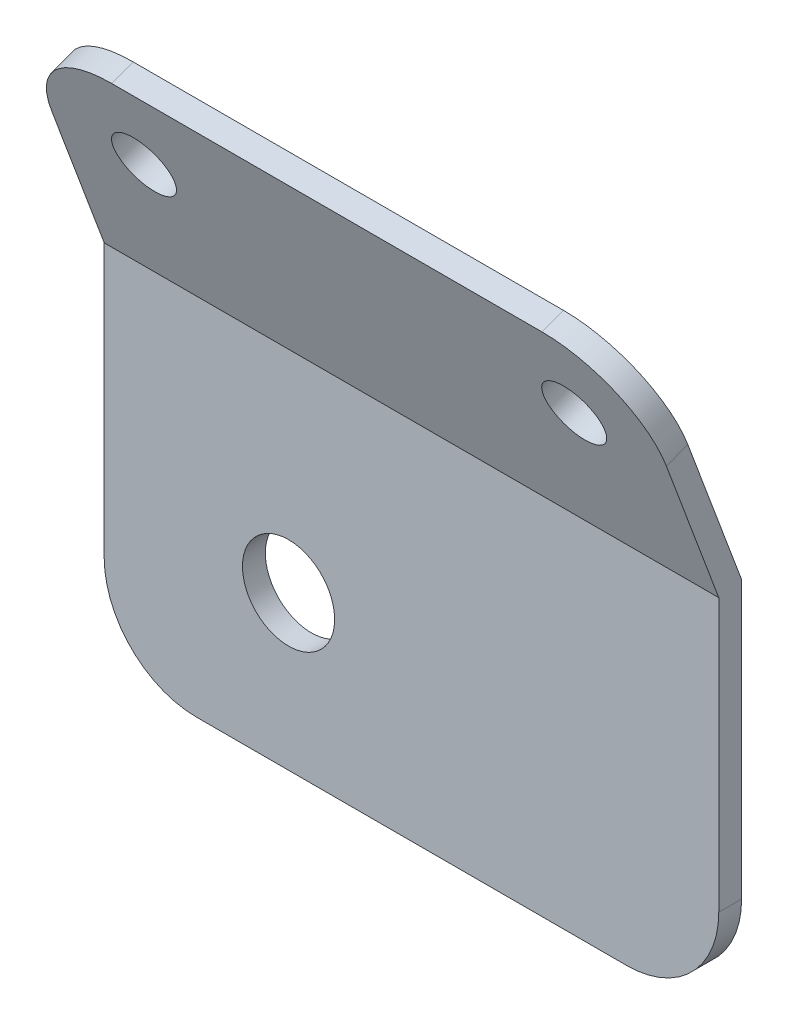
ISO-10303-21;
HEADER;
FILE_DESCRIPTION(('STEP AP214'),'2;1');
FILE_NAME('part.step','',(''),(''),'','','');
FILE_SCHEMA(('AUTOMOTIVE_DESIGN { 1 0 10303 214 1 1 1 1 }'));
ENDSEC;
DATA;
#1=APPLICATION_CONTEXT('core data for automotive mechanical design processes');
#2=APPLICATION_PROTOCOL_DEFINITION('international standard','automotive_design',2000,#1);
#3=PRODUCT_CONTEXT('',#1,'mechanical');
#4=PRODUCT('Part','Part','',(#3));
#5=PRODUCT_RELATED_PRODUCT_CATEGORY('part','',(#4));
#6=PRODUCT_DEFINITION_FORMATION('','',#4);
#7=PRODUCT_DEFINITION_CONTEXT('part definition',#1,'design');
#8=PRODUCT_DEFINITION('design','',#6,#7);
#9=PRODUCT_DEFINITION_SHAPE('','',#8);
#10=(LENGTH_UNIT() NAMED_UNIT(*) SI_UNIT(.MILLI.,.METRE.));
#11=(NAMED_UNIT(*) PLANE_ANGLE_UNIT() SI_UNIT($,.RADIAN.));
#12=(NAMED_UNIT(*) SI_UNIT($,.STERADIAN.) SOLID_ANGLE_UNIT());
#13=UNCERTAINTY_MEASURE_WITH_UNIT(LENGTH_MEASURE(1.E-05),#10,'distance_accuracy_value','');
#14=(GEOMETRIC_REPRESENTATION_CONTEXT(3) GLOBAL_UNCERTAINTY_ASSIGNED_CONTEXT((#13)) GLOBAL_UNIT_ASSIGNED_CONTEXT((#10,
#11,#12)) REPRESENTATION_CONTEXT('',''));
#15=CARTESIAN_POINT('',(0.,0.,0.));
#16=DIRECTION('',(0.,0.,1.));
#17=DIRECTION('',(1.,0.,0.));
#18=AXIS2_PLACEMENT_3D('',#15,#16,#17);
#19=CARTESIAN_POINT('',(31.75,0.,2.3622));
#20=DIRECTION('',(0.,0.,-1.));
#21=DIRECTION('',(0.,1.,0.));
#22=AXIS2_PLACEMENT_3D('',#19,#20,#21);
#23=PLANE('',#22);
#24=CARTESIAN_POINT('',(-12.7,-22.225,2.3622));
#25=DIRECTION('',(0.,0.,-1.));
#26=DIRECTION('',(0.,1.,0.));
#27=AXIS2_PLACEMENT_3D('',#24,#25,#26);
#28=CIRCLE('',#27,4.7625);
#29=CARTESIAN_POINT('',(-12.7,-17.4625,2.3622));
#30=VERTEX_POINT('',#29);
#31=EDGE_CURVE('E141',#30,#30,#28,.T.);
#32=ORIENTED_EDGE('',*,*,#31,.T.);
#33=EDGE_LOOP('',(#32));
#34=FACE_BOUND('',#33,.T.);
#35=DIRECTION('',(0.,-1.,0.));
#36=VECTOR('',#35,1.);
#37=CARTESIAN_POINT('',(-31.75,0.,2.3622));
#38=LINE('',#37,#36);
#39=CARTESIAN_POINT('',(-31.75,-0.427155344411784,2.3622));
#40=VERTEX_POINT('',#39);
#41=CARTESIAN_POINT('',(-31.75,-28.575,2.3622));
#42=VERTEX_POINT('',#41);
#43=EDGE_CURVE('E138',#40,#42,#38,.T.);
#44=ORIENTED_EDGE('',*,*,#43,.T.);
#45=CARTESIAN_POINT('',(-22.225,-28.575,2.3622));
#46=DIRECTION('',(0.,0.,-1.));
#47=DIRECTION('',(0.,1.,0.));
#48=AXIS2_PLACEMENT_3D('',#45,#46,#47);
#49=CIRCLE('',#48,9.525);
#50=CARTESIAN_POINT('',(-22.225,-38.1,2.3622));
#51=VERTEX_POINT('',#50);
#52=EDGE_CURVE('E179',#42,#51,#49,.F.);
#53=ORIENTED_EDGE('',*,*,#52,.T.);
#54=DIRECTION('',(-1.,0.,0.));
#55=VECTOR('',#54,1.);
#56=CARTESIAN_POINT('',(31.75,-38.1,2.3622));
#57=LINE('',#56,#55);
#58=CARTESIAN_POINT('',(22.225,-38.1,2.3622));
#59=VERTEX_POINT('',#58);
#60=EDGE_CURVE('E162',#59,#51,#57,.T.);
#61=ORIENTED_EDGE('',*,*,#60,.F.);
#62=CARTESIAN_POINT('',(22.225,-28.575,2.3622));
#63=DIRECTION('',(0.,0.,-1.));
#64=DIRECTION('',(0.,1.,0.));
#65=AXIS2_PLACEMENT_3D('',#62,#63,#64);
#66=CIRCLE('',#65,9.525);
#67=CARTESIAN_POINT('',(31.75,-28.575,2.3622));
#68=VERTEX_POINT('',#67);
#69=EDGE_CURVE('E177',#59,#68,#66,.F.);
#70=ORIENTED_EDGE('',*,*,#69,.T.);
#71=DIRECTION('',(0.,-1.,0.));
#72=VECTOR('',#71,1.);
#73=CARTESIAN_POINT('',(31.75,0.,2.3622));
#74=LINE('',#73,#72);
#75=CARTESIAN_POINT('',(31.75,-0.427155344411784,2.3622));
#76=VERTEX_POINT('',#75);
#77=EDGE_CURVE('E146',#76,#68,#74,.T.);
#78=ORIENTED_EDGE('',*,*,#77,.F.);
#79=DIRECTION('',(-1.,0.,0.));
#80=VECTOR('',#79,1.);
#81=CARTESIAN_POINT('',(31.75,-0.427155344411784,2.3622));
#82=LINE('',#81,#80);
#83=EDGE_CURVE('E154',#76,#40,#82,.T.);
#84=ORIENTED_EDGE('',*,*,#83,.T.);
#85=EDGE_LOOP('',(#44,#53,#61,#70,#78,#84));
#86=FACE_BOUND('',#85,.T.);
#87=ADVANCED_FACE('F34',(#34,#86),#23,.F.);
#88=CARTESIAN_POINT('',(31.75,-38.1,0.));
#89=DIRECTION('',(0.,-1.,0.));
#90=DIRECTION('',(0.,0.,-1.));
#91=AXIS2_PLACEMENT_3D('',#88,#89,#90);
#92=PLANE('',#91);
#93=ORIENTED_EDGE('',*,*,#60,.T.);
#94=DIRECTION('',(0.,0.,1.));
#95=VECTOR('',#94,1.);
#96=CARTESIAN_POINT('',(-22.225,-38.1,0.));
#97=LINE('',#96,#95);
#98=CARTESIAN_POINT('',(-22.225,-38.1,0.));
#99=VERTEX_POINT('',#98);
#100=EDGE_CURVE('E184',#51,#99,#97,.F.);
#101=ORIENTED_EDGE('',*,*,#100,.T.);
#102=DIRECTION('',(-1.,0.,0.));
#103=VECTOR('',#102,1.);
#104=CARTESIAN_POINT('',(31.75,-38.1,0.));
#105=LINE('',#104,#103);
#106=CARTESIAN_POINT('',(22.225,-38.1,0.));
#107=VERTEX_POINT('',#106);
#108=EDGE_CURVE('E131',#107,#99,#105,.T.);
#109=ORIENTED_EDGE('',*,*,#108,.F.);
#110=DIRECTION('',(0.,0.,1.));
#111=VECTOR('',#110,1.);
#112=CARTESIAN_POINT('',(22.225,-38.1,2.3622));
#113=LINE('',#112,#111);
#114=EDGE_CURVE('E181',#107,#59,#113,.T.);
#115=ORIENTED_EDGE('',*,*,#114,.T.);
#116=EDGE_LOOP('',(#93,#101,#109,#115));
#117=FACE_BOUND('',#116,.T.);
#118=ADVANCED_FACE('F223',(#117),#92,.T.);
#119=CARTESIAN_POINT('',(31.75,0.,0.));
#120=DIRECTION('',(0.,0.,-1.));
#121=DIRECTION('',(0.,1.,0.));
#122=AXIS2_PLACEMENT_3D('',#119,#120,#121);
#123=PLANE('',#122);
#124=CARTESIAN_POINT('',(-12.7,-22.225,0.));
#125=DIRECTION('',(0.,0.,-1.));
#126=DIRECTION('',(0.,1.,0.));
#127=AXIS2_PLACEMENT_3D('',#124,#125,#126);
#128=CIRCLE('',#127,4.7625);
#129=CARTESIAN_POINT('',(-12.7,-17.4625,0.));
#130=VERTEX_POINT('',#129);
#131=EDGE_CURVE('E168',#130,#130,#128,.T.);
#132=ORIENTED_EDGE('',*,*,#131,.F.);
#133=EDGE_LOOP('',(#132));
#134=FACE_BOUND('',#133,.T.);
#135=ORIENTED_EDGE('',*,*,#108,.T.);
#136=CARTESIAN_POINT('',(-22.225,-28.575,0.));
#137=DIRECTION('',(0.,0.,-1.));
#138=DIRECTION('',(0.,1.,0.));
#139=AXIS2_PLACEMENT_3D('',#136,#137,#138);
#140=CIRCLE('',#139,9.525);
#141=CARTESIAN_POINT('',(-31.75,-28.575,0.));
#142=VERTEX_POINT('',#141);
#143=EDGE_CURVE('E137',#99,#142,#140,.T.);
#144=ORIENTED_EDGE('',*,*,#143,.T.);
#145=DIRECTION('',(0.,-1.,0.));
#146=VECTOR('',#145,1.);
#147=CARTESIAN_POINT('',(-31.75,0.,0.));
#148=LINE('',#147,#146);
#149=CARTESIAN_POINT('',(-31.75,0.,0.));
#150=VERTEX_POINT('',#149);
#151=EDGE_CURVE('E116',#150,#142,#148,.T.);
#152=ORIENTED_EDGE('',*,*,#151,.F.);
#153=DIRECTION('',(-1.,0.,0.));
#154=VECTOR('',#153,1.);
#155=CARTESIAN_POINT('',(31.75,0.,0.));
#156=LINE('',#155,#154);
#157=CARTESIAN_POINT('',(31.75,0.,0.));
#158=VERTEX_POINT('',#157);
#159=EDGE_CURVE('E124',#158,#150,#156,.T.);
#160=ORIENTED_EDGE('',*,*,#159,.F.);
#161=DIRECTION('',(0.,-1.,0.));
#162=VECTOR('',#161,1.);
#163=CARTESIAN_POINT('',(31.75,0.,0.));
#164=LINE('',#163,#162);
#165=CARTESIAN_POINT('',(31.75,-28.575,0.));
#166=VERTEX_POINT('',#165);
#167=EDGE_CURVE('E149',#158,#166,#164,.T.);
#168=ORIENTED_EDGE('',*,*,#167,.T.);
#169=CARTESIAN_POINT('',(22.225,-28.575,0.));
#170=DIRECTION('',(0.,0.,-1.));
#171=DIRECTION('',(0.,1.,0.));
#172=AXIS2_PLACEMENT_3D('',#169,#170,#171);
#173=CIRCLE('',#172,9.525);
#174=EDGE_CURVE('E186',#166,#107,#173,.T.);
#175=ORIENTED_EDGE('',*,*,#174,.T.);
#176=EDGE_LOOP('',(#135,#144,#152,#160,#168,#175));
#177=FACE_BOUND('',#176,.T.);
#178=ADVANCED_FACE('F135',(#134,#177),#123,.T.);
#179=CARTESIAN_POINT('',(31.75,23.7914736069093,8.89526748399051));
#180=DIRECTION('',(0.,0.350207381259469,-0.936672189248397));
#181=DIRECTION('',(0.,0.936672189248397,0.350207381259469));
#182=AXIS2_PLACEMENT_3D('',#179,#180,#181);
#183=PLANE('',#182);
#184=CARTESIAN_POINT('',(-22.225,14.8696710043183,5.55954217749407));
#185=DIRECTION('',(0.,0.350207381259469,-0.936672189248397));
#186=DIRECTION('',(0.,-0.936672189248397,-0.350207381259469));
#187=AXIS2_PLACEMENT_3D('',#184,#185,#186);
#188=CIRCLE('',#187,3.175);
#189=CARTESIAN_POINT('',(-22.225,11.8957368034546,4.44763374199525));
#190=VERTEX_POINT('',#189);
#191=EDGE_CURVE('E173',#190,#190,#188,.T.);
#192=ORIENTED_EDGE('',*,*,#191,.F.);
#193=EDGE_LOOP('',(#192));
#194=FACE_BOUND('',#193,.T.);
#195=CARTESIAN_POINT('',(22.225,14.8696710043183,5.55954217749407));
#196=DIRECTION('',(0.,0.350207381259469,-0.936672189248397));
#197=DIRECTION('',(0.,0.936672189248397,0.350207381259469));
#198=AXIS2_PLACEMENT_3D('',#195,#196,#197);
#199=CIRCLE('',#198,3.175);
#200=CARTESIAN_POINT('',(22.225,17.843605205182,6.67145061299288));
#201=VERTEX_POINT('',#200);
#202=EDGE_CURVE('E169',#201,#201,#199,.T.);
#203=ORIENTED_EDGE('',*,*,#202,.F.);
#204=EDGE_LOOP('',(#203));
#205=FACE_BOUND('',#204,.T.);
#206=DIRECTION('',(-1.,0.,0.));
#207=VECTOR('',#206,1.);
#208=CARTESIAN_POINT('',(31.75,23.7914736069093,8.89526748399051));
#209=LINE('',#208,#207);
#210=CARTESIAN_POINT('',(22.225,23.7914736069093,8.89526748399051));
#211=VERTEX_POINT('',#210);
#212=CARTESIAN_POINT('',(-22.225,23.7914736069093,8.89526748399051));
#213=VERTEX_POINT('',#212);
#214=EDGE_CURVE('E132',#211,#213,#209,.T.);
#215=ORIENTED_EDGE('',*,*,#214,.F.);
#216=CARTESIAN_POINT('',(22.225,14.8696710043183,5.55954217749407));
#217=DIRECTION('',(0.,0.350207381259469,-0.936672189248397));
#218=DIRECTION('',(0.,0.936672189248397,0.350207381259469));
#219=AXIS2_PLACEMENT_3D('',#216,#217,#218);
#220=CIRCLE('',#219,9.525);
#221=CARTESIAN_POINT('',(31.75,14.8696710043183,5.55954217749407));
#222=VERTEX_POINT('',#221);
#223=EDGE_CURVE('E56',#211,#222,#220,.T.);
#224=ORIENTED_EDGE('',*,*,#223,.T.);
#225=DIRECTION('',(0.,-0.936672189248397,-0.350207381259469));
#226=VECTOR('',#225,1.);
#227=CARTESIAN_POINT('',(31.75,23.7914736069093,8.89526748399051));
#228=LINE('',#227,#226);
#229=EDGE_CURVE('E127',#222,#158,#228,.T.);
#230=ORIENTED_EDGE('',*,*,#229,.T.);
#231=ORIENTED_EDGE('',*,*,#159,.T.);
#232=DIRECTION('',(0.,-0.936672189248397,-0.350207381259469));
#233=VECTOR('',#232,1.);
#234=CARTESIAN_POINT('',(-31.75,23.7914736069093,8.89526748399051));
#235=LINE('',#234,#233);
#236=CARTESIAN_POINT('',(-31.75,14.8696710043183,5.55954217749406));
#237=VERTEX_POINT('',#236);
#238=EDGE_CURVE('E111',#237,#150,#235,.T.);
#239=ORIENTED_EDGE('',*,*,#238,.F.);
#240=CARTESIAN_POINT('',(-22.225,14.8696710043183,5.55954217749406));
#241=DIRECTION('',(0.,0.350207381259469,-0.936672189248397));
#242=DIRECTION('',(0.,0.936672189248397,0.350207381259469));
#243=AXIS2_PLACEMENT_3D('',#240,#241,#242);
#244=CIRCLE('',#243,9.525);
#245=EDGE_CURVE('E48',#237,#213,#244,.T.);
#246=ORIENTED_EDGE('',*,*,#245,.T.);
#247=EDGE_LOOP('',(#215,#224,#230,#231,#239,#246));
#248=FACE_BOUND('',#247,.T.);
#249=ADVANCED_FACE('F125',(#194,#205,#248),#183,.T.);
#250=CARTESIAN_POINT('',(31.75,22.9642137308982,11.1078745294331));
#251=DIRECTION('',(0.,0.936672189248397,0.350207381259469));
#252=DIRECTION('',(0.,-0.350207381259469,0.936672189248397));
#253=AXIS2_PLACEMENT_3D('',#250,#251,#252);
#254=PLANE('',#253);
#255=DIRECTION('',(-1.,0.,0.));
#256=VECTOR('',#255,1.);
#257=CARTESIAN_POINT('',(31.75,22.9642137308982,11.1078745294331));
#258=LINE('',#257,#256);
#259=CARTESIAN_POINT('',(22.225,22.9642137308982,11.1078745294331));
#260=VERTEX_POINT('',#259);
#261=CARTESIAN_POINT('',(-22.225,22.9642137308982,11.1078745294331));
#262=VERTEX_POINT('',#261);
#263=EDGE_CURVE('E157',#260,#262,#258,.T.);
#264=ORIENTED_EDGE('',*,*,#263,.F.);
#265=DIRECTION('',(0.,0.350207381259469,-0.936672189248397));
#266=VECTOR('',#265,1.);
#267=CARTESIAN_POINT('',(22.225,23.7914736069093,8.8952674839905));
#268=LINE('',#267,#266);
#269=EDGE_CURVE('E195',#260,#211,#268,.T.);
#270=ORIENTED_EDGE('',*,*,#269,.T.);
#271=ORIENTED_EDGE('',*,*,#214,.T.);
#272=DIRECTION('',(0.,0.350207381259469,-0.936672189248397));
#273=VECTOR('',#272,1.);
#274=CARTESIAN_POINT('',(-22.225,22.9642137308982,11.1078745294331));
#275=LINE('',#274,#273);
#276=EDGE_CURVE('E193',#213,#262,#275,.F.);
#277=ORIENTED_EDGE('',*,*,#276,.T.);
#278=EDGE_LOOP('',(#264,#270,#271,#277));
#279=FACE_BOUND('',#278,.T.);
#280=ADVANCED_FACE('F209',(#279),#254,.T.);
#281=CARTESIAN_POINT('',(31.75,22.9642137308982,11.1078745294331));
#282=DIRECTION('',(0.,0.350207381259469,-0.936672189248397));
#283=DIRECTION('',(0.,0.936672189248397,0.350207381259469));
#284=AXIS2_PLACEMENT_3D('',#281,#282,#283);
#285=PLANE('',#284);
#286=CARTESIAN_POINT('',(-22.225,14.0424111283072,7.77214922293663));
#287=DIRECTION('',(0.,0.350207381259469,-0.936672189248397));
#288=DIRECTION('',(0.,0.936672189248397,0.350207381259469));
#289=AXIS2_PLACEMENT_3D('',#286,#287,#288);
#290=CIRCLE('',#289,3.175);
#291=CARTESIAN_POINT('',(-22.225,17.0163453291708,8.88405765843545));
#292=VERTEX_POINT('',#291);
#293=EDGE_CURVE('E170',#292,#292,#290,.T.);
#294=ORIENTED_EDGE('',*,*,#293,.T.);
#295=EDGE_LOOP('',(#294));
#296=FACE_BOUND('',#295,.T.);
#297=CARTESIAN_POINT('',(22.225,14.0424111283072,7.77214922293663));
#298=DIRECTION('',(0.,0.350207381259469,-0.936672189248397));
#299=DIRECTION('',(0.,0.936672189248397,0.350207381259469));
#300=AXIS2_PLACEMENT_3D('',#297,#298,#299);
#301=CIRCLE('',#300,3.175);
#302=CARTESIAN_POINT('',(22.225,17.0163453291708,8.88405765843545));
#303=VERTEX_POINT('',#302);
#304=EDGE_CURVE('E165',#303,#303,#301,.T.);
#305=ORIENTED_EDGE('',*,*,#304,.T.);
#306=EDGE_LOOP('',(#305));
#307=FACE_BOUND('',#306,.T.);
#308=DIRECTION('',(0.,-0.936672189248397,-0.350207381259469));
#309=VECTOR('',#308,1.);
#310=CARTESIAN_POINT('',(31.75,22.9642137308982,11.1078745294331));
#311=LINE('',#310,#309);
#312=CARTESIAN_POINT('',(31.75,14.0424111283072,7.77214922293663));
#313=VERTEX_POINT('',#312);
#314=EDGE_CURVE('E152',#313,#76,#311,.T.);
#315=ORIENTED_EDGE('',*,*,#314,.F.);
#316=CARTESIAN_POINT('',(22.225,14.0424111283072,7.77214922293663));
#317=DIRECTION('',(0.,0.350207381259469,-0.936672189248397));
#318=DIRECTION('',(0.,0.936672189248397,0.350207381259469));
#319=AXIS2_PLACEMENT_3D('',#316,#317,#318);
#320=CIRCLE('',#319,9.525);
#321=EDGE_CURVE('E11',#313,#260,#320,.F.);
#322=ORIENTED_EDGE('',*,*,#321,.T.);
#323=ORIENTED_EDGE('',*,*,#263,.T.);
#324=CARTESIAN_POINT('',(-22.225,14.0424111283072,7.77214922293663));
#325=DIRECTION('',(0.,0.350207381259469,-0.936672189248397));
#326=DIRECTION('',(0.,0.936672189248397,0.350207381259469));
#327=AXIS2_PLACEMENT_3D('',#324,#325,#326);
#328=CIRCLE('',#327,9.525);
#329=CARTESIAN_POINT('',(-31.75,14.0424111283072,7.77214922293663));
#330=VERTEX_POINT('',#329);
#331=EDGE_CURVE('E41',#262,#330,#328,.F.);
#332=ORIENTED_EDGE('',*,*,#331,.T.);
#333=DIRECTION('',(0.,-0.936672189248397,-0.350207381259469));
#334=VECTOR('',#333,1.);
#335=CARTESIAN_POINT('',(-31.75,22.9642137308982,11.1078745294331));
#336=LINE('',#335,#334);
#337=EDGE_CURVE('E121',#330,#40,#336,.T.);
#338=ORIENTED_EDGE('',*,*,#337,.T.);
#339=ORIENTED_EDGE('',*,*,#83,.F.);
#340=EDGE_LOOP('',(#315,#322,#323,#332,#338,#339));
#341=FACE_BOUND('',#340,.T.);
#342=ADVANCED_FACE('F201',(#296,#307,#341),#285,.F.);
#343=CARTESIAN_POINT('',(31.75,-38.1,2.3622));
#344=DIRECTION('',(-1.,0.,0.));
#345=DIRECTION('',(0.,0.,1.));
#346=AXIS2_PLACEMENT_3D('',#343,#344,#345);
#347=PLANE('',#346);
#348=ORIENTED_EDGE('',*,*,#77,.T.);
#349=DIRECTION('',(0.,0.,1.));
#350=VECTOR('',#349,1.);
#351=CARTESIAN_POINT('',(31.75,-28.575,0.));
#352=LINE('',#351,#350);
#353=EDGE_CURVE('E191',#68,#166,#352,.F.);
#354=ORIENTED_EDGE('',*,*,#353,.T.);
#355=ORIENTED_EDGE('',*,*,#167,.F.);
#356=ORIENTED_EDGE('',*,*,#229,.F.);
#357=DIRECTION('',(0.,0.350207381259469,-0.936672189248397));
#358=VECTOR('',#357,1.);
#359=CARTESIAN_POINT('',(31.75,14.0424111283072,7.77214922293663));
#360=LINE('',#359,#358);
#361=EDGE_CURVE('E189',#222,#313,#360,.F.);
#362=ORIENTED_EDGE('',*,*,#361,.T.);
#363=ORIENTED_EDGE('',*,*,#314,.T.);
#364=EDGE_LOOP('',(#348,#354,#355,#356,#362,#363));
#365=FACE_BOUND('',#364,.T.);
#366=ADVANCED_FACE('F211',(#365),#347,.F.);
#367=CARTESIAN_POINT('',(-31.75,-38.1,2.3622));
#368=DIRECTION('',(-1.,0.,0.));
#369=DIRECTION('',(0.,0.,1.));
#370=AXIS2_PLACEMENT_3D('',#367,#368,#369);
#371=PLANE('',#370);
#372=ORIENTED_EDGE('',*,*,#151,.T.);
#373=DIRECTION('',(0.,0.,1.));
#374=VECTOR('',#373,1.);
#375=CARTESIAN_POINT('',(-31.75,-28.575,2.3622));
#376=LINE('',#375,#374);
#377=EDGE_CURVE('E175',#142,#42,#376,.T.);
#378=ORIENTED_EDGE('',*,*,#377,.T.);
#379=ORIENTED_EDGE('',*,*,#43,.F.);
#380=ORIENTED_EDGE('',*,*,#337,.F.);
#381=DIRECTION('',(0.,0.350207381259469,-0.936672189248397));
#382=VECTOR('',#381,1.);
#383=CARTESIAN_POINT('',(-31.75,9.42201718842137,20.1299541649644));
#384=LINE('',#383,#382);
#385=EDGE_CURVE('E120',#330,#237,#384,.T.);
#386=ORIENTED_EDGE('',*,*,#385,.T.);
#387=ORIENTED_EDGE('',*,*,#238,.T.);
#388=EDGE_LOOP('',(#372,#378,#379,#380,#386,#387));
#389=FACE_BOUND('',#388,.T.);
#390=ADVANCED_FACE('F113',(#389),#371,.T.);
#391=CARTESIAN_POINT('',(-12.7,-22.225,11.1078745294331));
#392=DIRECTION('',(0.,0.,-1.));
#393=DIRECTION('',(0.,1.,0.));
#394=AXIS2_PLACEMENT_3D('',#391,#392,#393);
#395=CYLINDRICAL_SURFACE('',#394,4.7625);
#396=ORIENTED_EDGE('',*,*,#131,.T.);
#397=EDGE_LOOP('',(#396));
#398=FACE_BOUND('',#397,.T.);
#399=ORIENTED_EDGE('',*,*,#31,.F.);
#400=EDGE_LOOP('',(#399));
#401=FACE_BOUND('',#400,.T.);
#402=ADVANCED_FACE('F255',(#398,#401),#395,.F.);
#403=CARTESIAN_POINT('',(22.225,6.55317781859794,27.8030136061176));
#404=DIRECTION('',(0.,0.350207381259469,-0.936672189248397));
#405=DIRECTION('',(0.,0.936672189248397,0.350207381259469));
#406=AXIS2_PLACEMENT_3D('',#403,#404,#405);
#407=CYLINDRICAL_SURFACE('',#406,3.175);
#408=ORIENTED_EDGE('',*,*,#202,.T.);
#409=EDGE_LOOP('',(#408));
#410=FACE_BOUND('',#409,.T.);
#411=ORIENTED_EDGE('',*,*,#304,.F.);
#412=EDGE_LOOP('',(#411));
#413=FACE_BOUND('',#412,.T.);
#414=ADVANCED_FACE('F252',(#410,#413),#407,.F.);
#415=CARTESIAN_POINT('',(-22.225,6.55317781859794,27.8030136061176));
#416=DIRECTION('',(0.,0.350207381259469,-0.936672189248397));
#417=DIRECTION('',(0.,0.936672189248397,0.350207381259469));
#418=AXIS2_PLACEMENT_3D('',#415,#416,#417);
#419=CYLINDRICAL_SURFACE('',#418,3.175);
#420=ORIENTED_EDGE('',*,*,#191,.T.);
#421=EDGE_LOOP('',(#420));
#422=FACE_BOUND('',#421,.T.);
#423=ORIENTED_EDGE('',*,*,#293,.F.);
#424=EDGE_LOOP('',(#423));
#425=FACE_BOUND('',#424,.T.);
#426=ADVANCED_FACE('F244',(#422,#425),#419,.F.);
#427=CARTESIAN_POINT('',(-22.225,-28.575,2.3622));
#428=DIRECTION('',(0.,0.,1.));
#429=DIRECTION('',(1.,0.,0.));
#430=AXIS2_PLACEMENT_3D('',#427,#428,#429);
#431=CYLINDRICAL_SURFACE('',#430,9.525);
#432=ORIENTED_EDGE('',*,*,#143,.F.);
#433=ORIENTED_EDGE('',*,*,#100,.F.);
#434=ORIENTED_EDGE('',*,*,#52,.F.);
#435=ORIENTED_EDGE('',*,*,#377,.F.);
#436=EDGE_LOOP('',(#432,#433,#434,#435));
#437=FACE_BOUND('',#436,.T.);
#438=ADVANCED_FACE('F227',(#437),#431,.T.);
#439=CARTESIAN_POINT('',(22.225,-28.575,0.));
#440=DIRECTION('',(0.,0.,-1.));
#441=DIRECTION('',(-1.,0.,0.));
#442=AXIS2_PLACEMENT_3D('',#439,#440,#441);
#443=CYLINDRICAL_SURFACE('',#442,9.525);
#444=ORIENTED_EDGE('',*,*,#174,.F.);
#445=ORIENTED_EDGE('',*,*,#353,.F.);
#446=ORIENTED_EDGE('',*,*,#69,.F.);
#447=ORIENTED_EDGE('',*,*,#114,.F.);
#448=EDGE_LOOP('',(#444,#445,#446,#447));
#449=FACE_BOUND('',#448,.T.);
#450=ADVANCED_FACE('F219',(#449),#443,.T.);
#451=CARTESIAN_POINT('',(22.225,14.0424111283072,7.77214922293663));
#452=DIRECTION('',(0.,-0.350207381259469,0.936672189248397));
#453=DIRECTION('',(0.,-0.936672189248397,-0.350207381259469));
#454=AXIS2_PLACEMENT_3D('',#451,#452,#453);
#455=CYLINDRICAL_SURFACE('',#454,9.525);
#456=ORIENTED_EDGE('',*,*,#321,.F.);
#457=ORIENTED_EDGE('',*,*,#361,.F.);
#458=ORIENTED_EDGE('',*,*,#223,.F.);
#459=ORIENTED_EDGE('',*,*,#269,.F.);
#460=EDGE_LOOP('',(#456,#457,#458,#459));
#461=FACE_BOUND('',#460,.T.);
#462=ADVANCED_FACE('F213',(#461),#455,.T.);
#463=CARTESIAN_POINT('',(-22.225,9.42201718842137,20.1299541649644));
#464=DIRECTION('',(0.,0.350207381259469,-0.936672189248397));
#465=DIRECTION('',(0.,0.936672189248397,0.350207381259469));
#466=AXIS2_PLACEMENT_3D('',#463,#464,#465);
#467=CYLINDRICAL_SURFACE('',#466,9.525);
#468=ORIENTED_EDGE('',*,*,#331,.F.);
#469=ORIENTED_EDGE('',*,*,#276,.F.);
#470=ORIENTED_EDGE('',*,*,#245,.F.);
#471=ORIENTED_EDGE('',*,*,#385,.F.);
#472=EDGE_LOOP('',(#468,#469,#470,#471));
#473=FACE_BOUND('',#472,.T.);
#474=ADVANCED_FACE('F207',(#473),#467,.T.);
#475=CLOSED_SHELL('',(#87,#118,#178,#249,#280,#342,#366,#390,#402,#414,#426,#438,#450,#462,#474));
#476=MANIFOLD_SOLID_BREP('B2',#475);
#477=ADVANCED_BREP_SHAPE_REPRESENTATION('',(#18,#476),#14);
#478=SHAPE_DEFINITION_REPRESENTATION(#9,#477);
ENDSEC;
END-ISO-10303-21;
